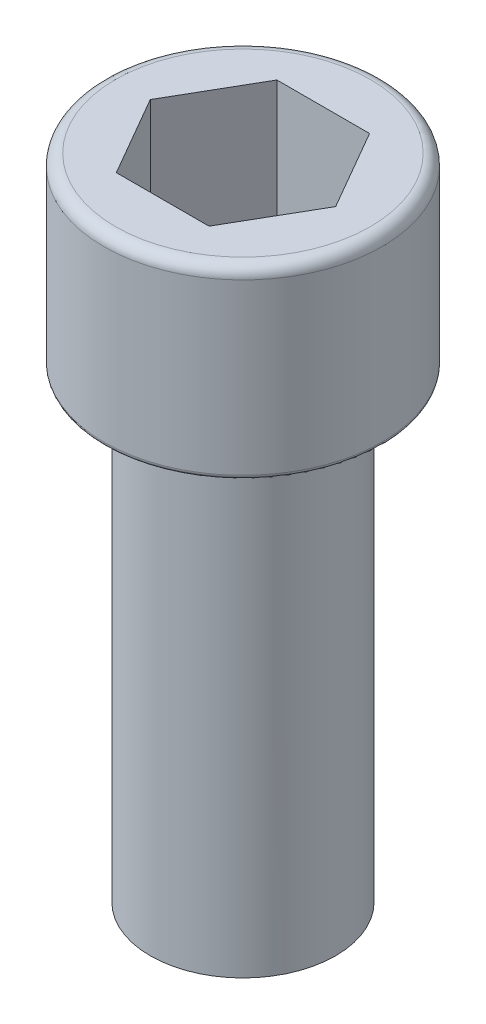
ISO-10303-21;
HEADER;
FILE_DESCRIPTION(('STEP AP214'),'2;1');
FILE_NAME('part.step','',(''),(''),'','','');
FILE_SCHEMA(('AUTOMOTIVE_DESIGN { 1 0 10303 214 1 1 1 1 }'));
ENDSEC;
DATA;
#1=APPLICATION_CONTEXT('core data for automotive mechanical design processes');
#2=APPLICATION_PROTOCOL_DEFINITION('international standard','automotive_design',2000,#1);
#3=PRODUCT_CONTEXT('',#1,'mechanical');
#4=PRODUCT('Part','Part','',(#3));
#5=PRODUCT_RELATED_PRODUCT_CATEGORY('part','',(#4));
#6=PRODUCT_DEFINITION_FORMATION('','',#4);
#7=PRODUCT_DEFINITION_CONTEXT('part definition',#1,'design');
#8=PRODUCT_DEFINITION('design','',#6,#7);
#9=PRODUCT_DEFINITION_SHAPE('','',#8);
#10=(LENGTH_UNIT() NAMED_UNIT(*) SI_UNIT(.MILLI.,.METRE.));
#11=(NAMED_UNIT(*) PLANE_ANGLE_UNIT() SI_UNIT($,.RADIAN.));
#12=(NAMED_UNIT(*) SI_UNIT($,.STERADIAN.) SOLID_ANGLE_UNIT());
#13=UNCERTAINTY_MEASURE_WITH_UNIT(LENGTH_MEASURE(1.E-05),#10,'distance_accuracy_value','');
#14=(GEOMETRIC_REPRESENTATION_CONTEXT(3) GLOBAL_UNCERTAINTY_ASSIGNED_CONTEXT((#13)) GLOBAL_UNIT_ASSIGNED_CONTEXT((#10,
#11,#12)) REPRESENTATION_CONTEXT('',''));
#15=CARTESIAN_POINT('',(0.,0.,0.));
#16=DIRECTION('',(0.,0.,1.));
#17=DIRECTION('',(1.,0.,0.));
#18=AXIS2_PLACEMENT_3D('',#15,#16,#17);
#19=CARTESIAN_POINT('',(0.,4.,0.));
#20=DIRECTION('',(0.,-1.,0.));
#21=DIRECTION('',(0.,0.,-1.));
#22=AXIS2_PLACEMENT_3D('',#19,#20,#21);
#23=CYLINDRICAL_SURFACE('',#22,3.);
#24=CARTESIAN_POINT('',(0.,0.0999999999999998,0.));
#25=DIRECTION('',(0.,1.,0.));
#26=DIRECTION('',(0.,0.,1.));
#27=AXIS2_PLACEMENT_3D('',#24,#25,#26);
#28=CIRCLE('',#27,3.);
#29=CARTESIAN_POINT('',(0.,0.0999999999999998,3.));
#30=VERTEX_POINT('',#29);
#31=EDGE_CURVE('E172',#30,#30,#28,.T.);
#32=ORIENTED_EDGE('',*,*,#31,.T.);
#33=EDGE_LOOP('',(#32));
#34=FACE_BOUND('',#33,.T.);
#35=CARTESIAN_POINT('',(0.,3.75,0.));
#36=DIRECTION('',(0.,1.,0.));
#37=DIRECTION('',(0.,0.,1.));
#38=AXIS2_PLACEMENT_3D('',#35,#36,#37);
#39=CIRCLE('',#38,3.);
#40=CARTESIAN_POINT('',(0.,3.75,3.));
#41=VERTEX_POINT('',#40);
#42=EDGE_CURVE('E168',#41,#41,#39,.F.);
#43=ORIENTED_EDGE('',*,*,#42,.T.);
#44=EDGE_LOOP('',(#43));
#45=FACE_BOUND('',#44,.T.);
#46=ADVANCED_FACE('F39',(#34,#45),#23,.T.);
#47=CARTESIAN_POINT('',(0.,4.,0.));
#48=DIRECTION('',(0.,1.,0.));
#49=DIRECTION('',(0.,0.,1.));
#50=AXIS2_PLACEMENT_3D('',#47,#48,#49);
#51=PLANE('',#50);
#52=DIRECTION('',(0.5,0.,-0.866025403784439));
#53=VECTOR('',#52,1.);
#54=CARTESIAN_POINT('',(1.,4.,1.73205080756888));
#55=LINE('',#54,#53);
#56=CARTESIAN_POINT('',(1.,4.,1.73205080756888));
#57=VERTEX_POINT('',#56);
#58=CARTESIAN_POINT('',(2.,4.,0.));
#59=VERTEX_POINT('',#58);
#60=EDGE_CURVE('E55',#57,#59,#55,.T.);
#61=ORIENTED_EDGE('',*,*,#60,.F.);
#62=DIRECTION('',(1.,0.,0.));
#63=VECTOR('',#62,1.);
#64=CARTESIAN_POINT('',(-1.,4.,1.73205080756888));
#65=LINE('',#64,#63);
#66=CARTESIAN_POINT('',(-1.,4.,1.73205080756888));
#67=VERTEX_POINT('',#66);
#68=EDGE_CURVE('E149',#67,#57,#65,.T.);
#69=ORIENTED_EDGE('',*,*,#68,.F.);
#70=DIRECTION('',(0.5,0.,0.866025403784439));
#71=VECTOR('',#70,1.);
#72=CARTESIAN_POINT('',(-2.,4.,0.));
#73=LINE('',#72,#71);
#74=CARTESIAN_POINT('',(-2.,4.,0.));
#75=VERTEX_POINT('',#74);
#76=EDGE_CURVE('E146',#75,#67,#73,.T.);
#77=ORIENTED_EDGE('',*,*,#76,.F.);
#78=DIRECTION('',(-0.499999999999999,0.,0.866025403784439));
#79=VECTOR('',#78,1.);
#80=CARTESIAN_POINT('',(-1.,4.,-1.73205080756888));
#81=LINE('',#80,#79);
#82=CARTESIAN_POINT('',(-1.,4.,-1.73205080756888));
#83=VERTEX_POINT('',#82);
#84=EDGE_CURVE('E103',#83,#75,#81,.T.);
#85=ORIENTED_EDGE('',*,*,#84,.F.);
#86=DIRECTION('',(-1.,0.,0.));
#87=VECTOR('',#86,1.);
#88=CARTESIAN_POINT('',(1.,4.,-1.73205080756888));
#89=LINE('',#88,#87);
#90=CARTESIAN_POINT('',(1.,4.,-1.73205080756888));
#91=VERTEX_POINT('',#90);
#92=EDGE_CURVE('E140',#91,#83,#89,.T.);
#93=ORIENTED_EDGE('',*,*,#92,.F.);
#94=DIRECTION('',(-0.499999999999999,0.,-0.866025403784439));
#95=VECTOR('',#94,1.);
#96=CARTESIAN_POINT('',(2.,4.,0.));
#97=LINE('',#96,#95);
#98=EDGE_CURVE('E135',#59,#91,#97,.T.);
#99=ORIENTED_EDGE('',*,*,#98,.F.);
#100=EDGE_LOOP('',(#61,#69,#77,#85,#93,#99));
#101=FACE_BOUND('',#100,.T.);
#102=CARTESIAN_POINT('',(0.,4.,0.));
#103=DIRECTION('',(0.,1.,0.));
#104=DIRECTION('',(0.,0.,1.));
#105=AXIS2_PLACEMENT_3D('',#102,#103,#104);
#106=CIRCLE('',#105,2.75);
#107=CARTESIAN_POINT('',(0.,4.,2.75));
#108=VERTEX_POINT('',#107);
#109=EDGE_CURVE('E155',#108,#108,#106,.T.);
#110=ORIENTED_EDGE('',*,*,#109,.T.);
#111=EDGE_LOOP('',(#110));
#112=FACE_BOUND('',#111,.T.);
#113=ADVANCED_FACE('F188',(#101,#112),#51,.T.);
#114=CARTESIAN_POINT('',(0.,0.,0.));
#115=DIRECTION('',(0.,1.,0.));
#116=DIRECTION('',(0.,0.,1.));
#117=AXIS2_PLACEMENT_3D('',#114,#115,#116);
#118=PLANE('',#117);
#119=CARTESIAN_POINT('',(0.,0.,0.));
#120=DIRECTION('',(0.,1.,0.));
#121=DIRECTION('',(0.,0.,1.));
#122=AXIS2_PLACEMENT_3D('',#119,#120,#121);
#123=CIRCLE('',#122,2.);
#124=CARTESIAN_POINT('',(0.,0.,2.));
#125=VERTEX_POINT('',#124);
#126=EDGE_CURVE('E11',#125,#125,#123,.F.);
#127=ORIENTED_EDGE('',*,*,#126,.F.);
#128=EDGE_LOOP('',(#127));
#129=FACE_BOUND('',#128,.T.);
#130=CARTESIAN_POINT('',(0.,0.,0.));
#131=DIRECTION('',(0.,1.,0.));
#132=DIRECTION('',(0.,0.,1.));
#133=AXIS2_PLACEMENT_3D('',#130,#131,#132);
#134=CIRCLE('',#133,2.9);
#135=CARTESIAN_POINT('',(0.,0.,2.9));
#136=VERTEX_POINT('',#135);
#137=EDGE_CURVE('E48',#136,#136,#134,.F.);
#138=ORIENTED_EDGE('',*,*,#137,.T.);
#139=EDGE_LOOP('',(#138));
#140=FACE_BOUND('',#139,.T.);
#141=ADVANCED_FACE('F179',(#129,#140),#118,.F.);
#142=CARTESIAN_POINT('',(0.,3.75,0.));
#143=DIRECTION('',(0.,1.,0.));
#144=DIRECTION('',(0.,0.,1.));
#145=AXIS2_PLACEMENT_3D('',#142,#143,#144);
#146=TOROIDAL_SURFACE('',#145,2.75,0.25);
#147=ORIENTED_EDGE('',*,*,#42,.F.);
#148=EDGE_LOOP('',(#147));
#149=FACE_BOUND('',#148,.T.);
#150=ORIENTED_EDGE('',*,*,#109,.F.);
#151=EDGE_LOOP('',(#150));
#152=FACE_BOUND('',#151,.T.);
#153=ADVANCED_FACE('F192',(#149,#152),#146,.T.);
#154=CARTESIAN_POINT('',(1.,1.,1.73205080756888));
#155=DIRECTION('',(0.866025403784439,0.,0.5));
#156=DIRECTION('',(0.5,0.,-0.866025403784439));
#157=AXIS2_PLACEMENT_3D('',#154,#155,#156);
#158=PLANE('',#157);
#159=ORIENTED_EDGE('',*,*,#60,.T.);
#160=DIRECTION('',(0.,1.,0.));
#161=VECTOR('',#160,1.);
#162=CARTESIAN_POINT('',(2.,1.,0.));
#163=LINE('',#162,#161);
#164=CARTESIAN_POINT('',(2.,1.,0.));
#165=VERTEX_POINT('',#164);
#166=EDGE_CURVE('E85',#165,#59,#163,.T.);
#167=ORIENTED_EDGE('',*,*,#166,.F.);
#168=DIRECTION('',(0.5,0.,-0.866025403784439));
#169=VECTOR('',#168,1.);
#170=CARTESIAN_POINT('',(1.,1.,1.73205080756888));
#171=LINE('',#170,#169);
#172=CARTESIAN_POINT('',(1.,1.,1.73205080756888));
#173=VERTEX_POINT('',#172);
#174=EDGE_CURVE('E152',#173,#165,#171,.T.);
#175=ORIENTED_EDGE('',*,*,#174,.F.);
#176=DIRECTION('',(0.,1.,0.));
#177=VECTOR('',#176,1.);
#178=CARTESIAN_POINT('',(1.,1.,1.73205080756888));
#179=LINE('',#178,#177);
#180=EDGE_CURVE('E63',#173,#57,#179,.T.);
#181=ORIENTED_EDGE('',*,*,#180,.T.);
#182=EDGE_LOOP('',(#159,#167,#175,#181));
#183=FACE_BOUND('',#182,.T.);
#184=ADVANCED_FACE('F195',(#183),#158,.F.);
#185=CARTESIAN_POINT('',(-1.,1.,1.73205080756888));
#186=DIRECTION('',(0.,0.,1.));
#187=DIRECTION('',(1.,0.,0.));
#188=AXIS2_PLACEMENT_3D('',#185,#186,#187);
#189=PLANE('',#188);
#190=ORIENTED_EDGE('',*,*,#68,.T.);
#191=ORIENTED_EDGE('',*,*,#180,.F.);
#192=DIRECTION('',(1.,0.,0.));
#193=VECTOR('',#192,1.);
#194=CARTESIAN_POINT('',(-1.,1.,1.73205080756888));
#195=LINE('',#194,#193);
#196=CARTESIAN_POINT('',(-1.,1.,1.73205080756888));
#197=VERTEX_POINT('',#196);
#198=EDGE_CURVE('E117',#197,#173,#195,.T.);
#199=ORIENTED_EDGE('',*,*,#198,.F.);
#200=DIRECTION('',(0.,1.,0.));
#201=VECTOR('',#200,1.);
#202=CARTESIAN_POINT('',(-1.,1.,1.73205080756888));
#203=LINE('',#202,#201);
#204=EDGE_CURVE('E108',#197,#67,#203,.T.);
#205=ORIENTED_EDGE('',*,*,#204,.T.);
#206=EDGE_LOOP('',(#190,#191,#199,#205));
#207=FACE_BOUND('',#206,.T.);
#208=ADVANCED_FACE('F209',(#207),#189,.F.);
#209=CARTESIAN_POINT('',(-2.,1.,0.));
#210=DIRECTION('',(-0.866025403784439,0.,0.5));
#211=DIRECTION('',(0.5,0.,0.866025403784439));
#212=AXIS2_PLACEMENT_3D('',#209,#210,#211);
#213=PLANE('',#212);
#214=ORIENTED_EDGE('',*,*,#76,.T.);
#215=ORIENTED_EDGE('',*,*,#204,.F.);
#216=DIRECTION('',(0.5,0.,0.866025403784439));
#217=VECTOR('',#216,1.);
#218=CARTESIAN_POINT('',(-2.,1.,0.));
#219=LINE('',#218,#217);
#220=CARTESIAN_POINT('',(-2.,1.,0.));
#221=VERTEX_POINT('',#220);
#222=EDGE_CURVE('E112',#221,#197,#219,.T.);
#223=ORIENTED_EDGE('',*,*,#222,.F.);
#224=DIRECTION('',(0.,1.,0.));
#225=VECTOR('',#224,1.);
#226=CARTESIAN_POINT('',(-2.,1.,0.));
#227=LINE('',#226,#225);
#228=EDGE_CURVE('E96',#221,#75,#227,.T.);
#229=ORIENTED_EDGE('',*,*,#228,.T.);
#230=EDGE_LOOP('',(#214,#215,#223,#229));
#231=FACE_BOUND('',#230,.T.);
#232=ADVANCED_FACE('F113',(#231),#213,.F.);
#233=CARTESIAN_POINT('',(-1.,1.,-1.73205080756888));
#234=DIRECTION('',(-0.866025403784439,0.,-0.499999999999999));
#235=DIRECTION('',(-0.499999999999999,0.,0.866025403784439));
#236=AXIS2_PLACEMENT_3D('',#233,#234,#235);
#237=PLANE('',#236);
#238=ORIENTED_EDGE('',*,*,#84,.T.);
#239=ORIENTED_EDGE('',*,*,#228,.F.);
#240=DIRECTION('',(-0.499999999999999,0.,0.866025403784439));
#241=VECTOR('',#240,1.);
#242=CARTESIAN_POINT('',(-1.,1.,-1.73205080756888));
#243=LINE('',#242,#241);
#244=CARTESIAN_POINT('',(-1.,1.,-1.73205080756888));
#245=VERTEX_POINT('',#244);
#246=EDGE_CURVE('E100',#245,#221,#243,.T.);
#247=ORIENTED_EDGE('',*,*,#246,.F.);
#248=DIRECTION('',(0.,1.,0.));
#249=VECTOR('',#248,1.);
#250=CARTESIAN_POINT('',(-1.,1.,-1.73205080756888));
#251=LINE('',#250,#249);
#252=EDGE_CURVE('E109',#245,#83,#251,.T.);
#253=ORIENTED_EDGE('',*,*,#252,.T.);
#254=EDGE_LOOP('',(#238,#239,#247,#253));
#255=FACE_BOUND('',#254,.T.);
#256=ADVANCED_FACE('F98',(#255),#237,.F.);
#257=CARTESIAN_POINT('',(1.,1.,-1.73205080756888));
#258=DIRECTION('',(0.,0.,-1.));
#259=DIRECTION('',(-1.,0.,0.));
#260=AXIS2_PLACEMENT_3D('',#257,#258,#259);
#261=PLANE('',#260);
#262=ORIENTED_EDGE('',*,*,#92,.T.);
#263=ORIENTED_EDGE('',*,*,#252,.F.);
#264=DIRECTION('',(-1.,0.,0.));
#265=VECTOR('',#264,1.);
#266=CARTESIAN_POINT('',(1.,1.,-1.73205080756888));
#267=LINE('',#266,#265);
#268=CARTESIAN_POINT('',(1.,1.,-1.73205080756888));
#269=VERTEX_POINT('',#268);
#270=EDGE_CURVE('E123',#269,#245,#267,.T.);
#271=ORIENTED_EDGE('',*,*,#270,.F.);
#272=DIRECTION('',(0.,1.,0.));
#273=VECTOR('',#272,1.);
#274=CARTESIAN_POINT('',(1.,1.,-1.73205080756888));
#275=LINE('',#274,#273);
#276=EDGE_CURVE('E160',#269,#91,#275,.T.);
#277=ORIENTED_EDGE('',*,*,#276,.T.);
#278=EDGE_LOOP('',(#262,#263,#271,#277));
#279=FACE_BOUND('',#278,.T.);
#280=ADVANCED_FACE('F213',(#279),#261,.F.);
#281=CARTESIAN_POINT('',(2.,1.,0.));
#282=DIRECTION('',(0.866025403784439,0.,-0.499999999999999));
#283=DIRECTION('',(-0.499999999999999,0.,-0.866025403784439));
#284=AXIS2_PLACEMENT_3D('',#281,#282,#283);
#285=PLANE('',#284);
#286=ORIENTED_EDGE('',*,*,#98,.T.);
#287=ORIENTED_EDGE('',*,*,#276,.F.);
#288=DIRECTION('',(-0.499999999999999,0.,-0.866025403784439));
#289=VECTOR('',#288,1.);
#290=CARTESIAN_POINT('',(2.,1.,0.));
#291=LINE('',#290,#289);
#292=EDGE_CURVE('E127',#165,#269,#291,.T.);
#293=ORIENTED_EDGE('',*,*,#292,.F.);
#294=ORIENTED_EDGE('',*,*,#166,.T.);
#295=EDGE_LOOP('',(#286,#287,#293,#294));
#296=FACE_BOUND('',#295,.T.);
#297=ADVANCED_FACE('F210',(#296),#285,.F.);
#298=CARTESIAN_POINT('',(0.,1.,0.));
#299=DIRECTION('',(0.,1.,0.));
#300=DIRECTION('',(0.,0.,1.));
#301=AXIS2_PLACEMENT_3D('',#298,#299,#300);
#302=PLANE('',#301);
#303=ORIENTED_EDGE('',*,*,#174,.T.);
#304=ORIENTED_EDGE('',*,*,#292,.T.);
#305=ORIENTED_EDGE('',*,*,#270,.T.);
#306=ORIENTED_EDGE('',*,*,#246,.T.);
#307=ORIENTED_EDGE('',*,*,#222,.T.);
#308=ORIENTED_EDGE('',*,*,#198,.T.);
#309=EDGE_LOOP('',(#303,#304,#305,#306,#307,#308));
#310=FACE_BOUND('',#309,.T.);
#311=ADVANCED_FACE('F120',(#310),#302,.T.);
#312=CARTESIAN_POINT('',(0.,0.0999999999999998,0.));
#313=DIRECTION('',(0.,1.,0.));
#314=DIRECTION('',(0.,0.,1.));
#315=AXIS2_PLACEMENT_3D('',#312,#313,#314);
#316=TOROIDAL_SURFACE('',#315,2.9,0.1);
#317=ORIENTED_EDGE('',*,*,#137,.F.);
#318=EDGE_LOOP('',(#317));
#319=FACE_BOUND('',#318,.T.);
#320=ORIENTED_EDGE('',*,*,#31,.F.);
#321=EDGE_LOOP('',(#320));
#322=FACE_BOUND('',#321,.T.);
#323=ADVANCED_FACE('F41',(#319,#322),#316,.T.);
#324=CARTESIAN_POINT('',(0.,-10.,0.));
#325=DIRECTION('',(0.,1.,0.));
#326=DIRECTION('',(0.,0.,1.));
#327=AXIS2_PLACEMENT_3D('',#324,#325,#326);
#328=CYLINDRICAL_SURFACE('',#327,2.);
#329=CARTESIAN_POINT('',(0.,-10.,0.));
#330=DIRECTION('',(0.,-1.,0.));
#331=DIRECTION('',(0.,0.,-1.));
#332=AXIS2_PLACEMENT_3D('',#329,#330,#331);
#333=CIRCLE('',#332,2.);
#334=CARTESIAN_POINT('',(0.,-10.,-2.));
#335=VERTEX_POINT('',#334);
#336=EDGE_CURVE('E136',#335,#335,#333,.T.);
#337=ORIENTED_EDGE('',*,*,#336,.F.);
#338=EDGE_LOOP('',(#337));
#339=FACE_BOUND('',#338,.T.);
#340=ORIENTED_EDGE('',*,*,#126,.T.);
#341=EDGE_LOOP('',(#340));
#342=FACE_BOUND('',#341,.T.);
#343=ADVANCED_FACE('F183',(#339,#342),#328,.T.);
#344=CARTESIAN_POINT('',(0.,-10.,0.));
#345=DIRECTION('',(0.,-1.,0.));
#346=DIRECTION('',(0.,0.,-1.));
#347=AXIS2_PLACEMENT_3D('',#344,#345,#346);
#348=PLANE('',#347);
#349=ORIENTED_EDGE('',*,*,#336,.T.);
#350=EDGE_LOOP('',(#349));
#351=FACE_BOUND('',#350,.T.);
#352=ADVANCED_FACE('F228',(#351),#348,.T.);
#353=CLOSED_SHELL('',(#46,#113,#141,#153,#184,#208,#232,#256,#280,#297,#311,#323,#343,#352));
#354=MANIFOLD_SOLID_BREP('B2',#353);
#355=ADVANCED_BREP_SHAPE_REPRESENTATION('',(#18,#354),#14);
#356=SHAPE_DEFINITION_REPRESENTATION(#9,#355);
ENDSEC;
END-ISO-10303-21;
